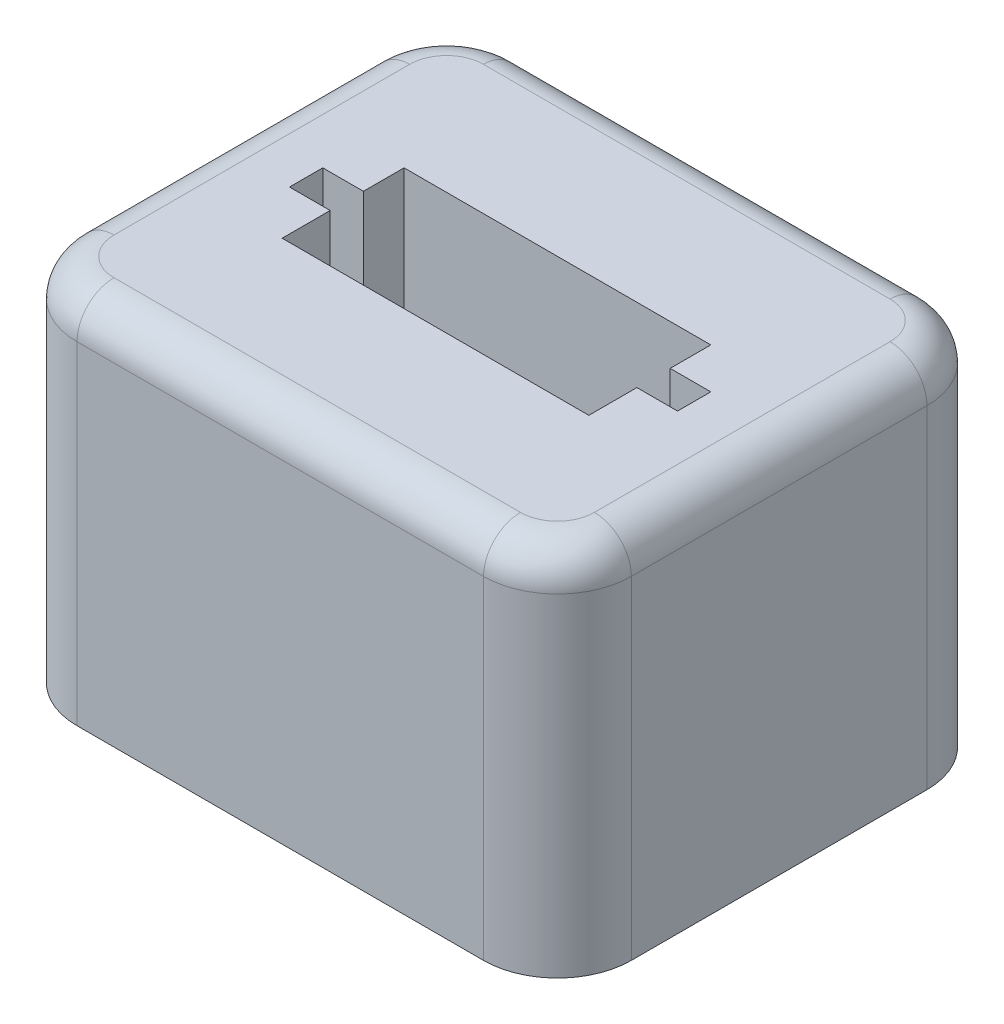
ISO-10303-21;
HEADER;
FILE_DESCRIPTION(('STEP AP214'),'2;1');
FILE_NAME('part.step','',(''),(''),'','','');
FILE_SCHEMA(('AUTOMOTIVE_DESIGN { 1 0 10303 214 1 1 1 1 }'));
ENDSEC;
DATA;
#1=APPLICATION_CONTEXT('core data for automotive mechanical design processes');
#2=APPLICATION_PROTOCOL_DEFINITION('international standard','automotive_design',2000,#1);
#3=PRODUCT_CONTEXT('',#1,'mechanical');
#4=PRODUCT('Part','Part','',(#3));
#5=PRODUCT_RELATED_PRODUCT_CATEGORY('part','',(#4));
#6=PRODUCT_DEFINITION_FORMATION('','',#4);
#7=PRODUCT_DEFINITION_CONTEXT('part definition',#1,'design');
#8=PRODUCT_DEFINITION('design','',#6,#7);
#9=PRODUCT_DEFINITION_SHAPE('','',#8);
#10=(LENGTH_UNIT() NAMED_UNIT(*) SI_UNIT(.MILLI.,.METRE.));
#11=(NAMED_UNIT(*) PLANE_ANGLE_UNIT() SI_UNIT($,.RADIAN.));
#12=(NAMED_UNIT(*) SI_UNIT($,.STERADIAN.) SOLID_ANGLE_UNIT());
#13=UNCERTAINTY_MEASURE_WITH_UNIT(LENGTH_MEASURE(1.E-05),#10,'distance_accuracy_value','');
#14=(GEOMETRIC_REPRESENTATION_CONTEXT(3) GLOBAL_UNCERTAINTY_ASSIGNED_CONTEXT((#13)) GLOBAL_UNIT_ASSIGNED_CONTEXT((#10,
#11,#12)) REPRESENTATION_CONTEXT('',''));
#15=CARTESIAN_POINT('',(0.,0.,0.));
#16=DIRECTION('',(0.,0.,1.));
#17=DIRECTION('',(1.,0.,0.));
#18=AXIS2_PLACEMENT_3D('',#15,#16,#17);
#19=CARTESIAN_POINT('',(4.5,-21.0770016843004,-12.8));
#20=DIRECTION('',(0.,0.,-1.));
#21=DIRECTION('',(-1.,0.,0.));
#22=AXIS2_PLACEMENT_3D('',#19,#20,#21);
#23=PLANE('',#22);
#24=DIRECTION('',(-1.,0.,0.));
#25=VECTOR('',#24,1.);
#26=CARTESIAN_POINT('',(4.5,20.,-12.8));
#27=LINE('',#26,#25);
#28=CARTESIAN_POINT('',(25.5,20.,-12.8));
#29=VERTEX_POINT('',#28);
#30=CARTESIAN_POINT('',(23.3,20.,-12.8));
#31=VERTEX_POINT('',#30);
#32=EDGE_CURVE('E235',#29,#31,#27,.T.);
#33=ORIENTED_EDGE('',*,*,#32,.T.);
#34=DIRECTION('',(0.,1.,0.));
#35=VECTOR('',#34,1.);
#36=CARTESIAN_POINT('',(23.3,-8.74514855114759,-12.8));
#37=LINE('',#36,#35);
#38=CARTESIAN_POINT('',(23.3,7.99999999999999,-12.8));
#39=VERTEX_POINT('',#38);
#40=EDGE_CURVE('E222',#39,#31,#37,.T.);
#41=ORIENTED_EDGE('',*,*,#40,.F.);
#42=DIRECTION('',(-1.,0.,0.));
#43=VECTOR('',#42,1.);
#44=CARTESIAN_POINT('',(4.5,8.,-12.8));
#45=LINE('',#44,#43);
#46=CARTESIAN_POINT('',(25.5,8.,-12.8));
#47=VERTEX_POINT('',#46);
#48=EDGE_CURVE('E232',#47,#39,#45,.T.);
#49=ORIENTED_EDGE('',*,*,#48,.F.);
#50=DIRECTION('',(0.,1.,0.));
#51=VECTOR('',#50,1.);
#52=CARTESIAN_POINT('',(25.5,-21.0770016843004,-12.8));
#53=LINE('',#52,#51);
#54=EDGE_CURVE('E252',#47,#29,#53,.T.);
#55=ORIENTED_EDGE('',*,*,#54,.T.);
#56=EDGE_LOOP('',(#33,#41,#49,#55));
#57=FACE_BOUND('',#56,.T.);
#58=ADVANCED_FACE('F43',(#57),#23,.F.);
#59=CARTESIAN_POINT('',(26.,20.,-20.));
#60=DIRECTION('',(0.,-1.,0.));
#61=DIRECTION('',(0.,0.,-1.));
#62=AXIS2_PLACEMENT_3D('',#59,#60,#61);
#63=CYLINDRICAL_SURFACE('',#62,4.);
#64=DIRECTION('',(0.,-1.,0.));
#65=VECTOR('',#64,1.);
#66=CARTESIAN_POINT('',(26.,20.,-24.));
#67=LINE('',#66,#65);
#68=CARTESIAN_POINT('',(26.,18.,-24.));
#69=VERTEX_POINT('',#68);
#70=CARTESIAN_POINT('',(26.,0.,-24.));
#71=VERTEX_POINT('',#70);
#72=EDGE_CURVE('E409',#69,#71,#67,.T.);
#73=ORIENTED_EDGE('',*,*,#72,.F.);
#74=CARTESIAN_POINT('',(26.,18.,-20.));
#75=DIRECTION('',(0.,-1.,0.));
#76=DIRECTION('',(0.,0.,-1.));
#77=AXIS2_PLACEMENT_3D('',#74,#75,#76);
#78=CIRCLE('',#77,4.);
#79=CARTESIAN_POINT('',(30.,18.,-20.));
#80=VERTEX_POINT('',#79);
#81=EDGE_CURVE('E456',#69,#80,#78,.T.);
#82=ORIENTED_EDGE('',*,*,#81,.T.);
#83=DIRECTION('',(0.,-1.,0.));
#84=VECTOR('',#83,1.);
#85=CARTESIAN_POINT('',(30.,20.,-20.));
#86=LINE('',#85,#84);
#87=CARTESIAN_POINT('',(30.,0.,-20.));
#88=VERTEX_POINT('',#87);
#89=EDGE_CURVE('E388',#80,#88,#86,.T.);
#90=ORIENTED_EDGE('',*,*,#89,.T.);
#91=CARTESIAN_POINT('',(26.,0.,-20.));
#92=DIRECTION('',(0.,1.,0.));
#93=DIRECTION('',(0.,0.,-1.));
#94=AXIS2_PLACEMENT_3D('',#91,#92,#93);
#95=CIRCLE('',#94,4.);
#96=EDGE_CURVE('E355',#88,#71,#95,.T.);
#97=ORIENTED_EDGE('',*,*,#96,.T.);
#98=EDGE_LOOP('',(#73,#82,#90,#97));
#99=FACE_BOUND('',#98,.T.);
#100=ADVANCED_FACE('F568',(#99),#63,.T.);
#101=CARTESIAN_POINT('',(4.00000000000003,20.,-24.));
#102=DIRECTION('',(0.,0.,1.));
#103=DIRECTION('',(1.,0.,0.));
#104=AXIS2_PLACEMENT_3D('',#101,#102,#103);
#105=PLANE('',#104);
#106=DIRECTION('',(0.,-1.,0.));
#107=VECTOR('',#106,1.);
#108=CARTESIAN_POINT('',(4.00000000000003,20.,-24.));
#109=LINE('',#108,#107);
#110=CARTESIAN_POINT('',(4.00000000000003,18.,-24.));
#111=VERTEX_POINT('',#110);
#112=CARTESIAN_POINT('',(4.00000000000003,0.,-24.));
#113=VERTEX_POINT('',#112);
#114=EDGE_CURVE('E406',#111,#113,#109,.T.);
#115=ORIENTED_EDGE('',*,*,#114,.F.);
#116=DIRECTION('',(-1.,0.,0.));
#117=VECTOR('',#116,1.);
#118=CARTESIAN_POINT('',(4.00000000000003,18.,-24.));
#119=LINE('',#118,#117);
#120=EDGE_CURVE('E453',#111,#69,#119,.F.);
#121=ORIENTED_EDGE('',*,*,#120,.T.);
#122=ORIENTED_EDGE('',*,*,#72,.T.);
#123=DIRECTION('',(-1.,0.,0.));
#124=VECTOR('',#123,1.);
#125=CARTESIAN_POINT('',(4.00000000000003,0.,-24.));
#126=LINE('',#125,#124);
#127=EDGE_CURVE('E359',#71,#113,#126,.T.);
#128=ORIENTED_EDGE('',*,*,#127,.T.);
#129=EDGE_LOOP('',(#115,#121,#122,#128));
#130=FACE_BOUND('',#129,.T.);
#131=ADVANCED_FACE('F573',(#130),#105,.F.);
#132=CARTESIAN_POINT('',(4.,20.,-20.));
#133=DIRECTION('',(0.,-1.,0.));
#134=DIRECTION('',(0.,0.,-1.));
#135=AXIS2_PLACEMENT_3D('',#132,#133,#134);
#136=CYLINDRICAL_SURFACE('',#135,4.);
#137=DIRECTION('',(0.,-1.,0.));
#138=VECTOR('',#137,1.);
#139=CARTESIAN_POINT('',(0.,20.,-20.));
#140=LINE('',#139,#138);
#141=CARTESIAN_POINT('',(0.,18.,-20.));
#142=VERTEX_POINT('',#141);
#143=CARTESIAN_POINT('',(0.,0.,-20.));
#144=VERTEX_POINT('',#143);
#145=EDGE_CURVE('E403',#142,#144,#140,.T.);
#146=ORIENTED_EDGE('',*,*,#145,.F.);
#147=CARTESIAN_POINT('',(4.,18.,-20.));
#148=DIRECTION('',(0.,-1.,0.));
#149=DIRECTION('',(0.,0.,-1.));
#150=AXIS2_PLACEMENT_3D('',#147,#148,#149);
#151=CIRCLE('',#150,4.);
#152=EDGE_CURVE('E450',#142,#111,#151,.T.);
#153=ORIENTED_EDGE('',*,*,#152,.T.);
#154=ORIENTED_EDGE('',*,*,#114,.T.);
#155=CARTESIAN_POINT('',(4.,0.,-20.));
#156=DIRECTION('',(0.,1.,0.));
#157=DIRECTION('',(0.,0.,-1.));
#158=AXIS2_PLACEMENT_3D('',#155,#156,#157);
#159=CIRCLE('',#158,4.);
#160=EDGE_CURVE('E364',#113,#144,#159,.T.);
#161=ORIENTED_EDGE('',*,*,#160,.T.);
#162=EDGE_LOOP('',(#146,#153,#154,#161));
#163=FACE_BOUND('',#162,.T.);
#164=ADVANCED_FACE('F667',(#163),#136,.T.);
#165=CARTESIAN_POINT('',(0.,20.,-4.00000000000003));
#166=DIRECTION('',(1.,0.,0.));
#167=DIRECTION('',(0.,0.,-1.));
#168=AXIS2_PLACEMENT_3D('',#165,#166,#167);
#169=PLANE('',#168);
#170=DIRECTION('',(0.,-1.,0.));
#171=VECTOR('',#170,1.);
#172=CARTESIAN_POINT('',(0.,20.,-4.00000000000003));
#173=LINE('',#172,#171);
#174=CARTESIAN_POINT('',(0.,18.,-4.00000000000003));
#175=VERTEX_POINT('',#174);
#176=CARTESIAN_POINT('',(0.,0.,-4.00000000000003));
#177=VERTEX_POINT('',#176);
#178=EDGE_CURVE('E400',#175,#177,#173,.T.);
#179=ORIENTED_EDGE('',*,*,#178,.F.);
#180=DIRECTION('',(0.,0.,1.));
#181=VECTOR('',#180,1.);
#182=CARTESIAN_POINT('',(0.,18.,-4.00000000000003));
#183=LINE('',#182,#181);
#184=EDGE_CURVE('E447',#175,#142,#183,.F.);
#185=ORIENTED_EDGE('',*,*,#184,.T.);
#186=ORIENTED_EDGE('',*,*,#145,.T.);
#187=DIRECTION('',(0.,0.,1.));
#188=VECTOR('',#187,1.);
#189=CARTESIAN_POINT('',(0.,0.,-4.00000000000003));
#190=LINE('',#189,#188);
#191=EDGE_CURVE('E368',#144,#177,#190,.T.);
#192=ORIENTED_EDGE('',*,*,#191,.T.);
#193=EDGE_LOOP('',(#179,#185,#186,#192));
#194=FACE_BOUND('',#193,.T.);
#195=ADVANCED_FACE('F663',(#194),#169,.F.);
#196=CARTESIAN_POINT('',(4.,20.,-4.));
#197=DIRECTION('',(0.,-1.,0.));
#198=DIRECTION('',(0.,0.,-1.));
#199=AXIS2_PLACEMENT_3D('',#196,#197,#198);
#200=CYLINDRICAL_SURFACE('',#199,4.);
#201=DIRECTION('',(0.,-1.,0.));
#202=VECTOR('',#201,1.);
#203=CARTESIAN_POINT('',(4.00000000000003,20.,0.));
#204=LINE('',#203,#202);
#205=CARTESIAN_POINT('',(4.00000000000003,18.,0.));
#206=VERTEX_POINT('',#205);
#207=CARTESIAN_POINT('',(4.00000000000003,0.,0.));
#208=VERTEX_POINT('',#207);
#209=EDGE_CURVE('E397',#206,#208,#204,.T.);
#210=ORIENTED_EDGE('',*,*,#209,.F.);
#211=CARTESIAN_POINT('',(4.,18.,-4.));
#212=DIRECTION('',(0.,-1.,0.));
#213=DIRECTION('',(0.,0.,-1.));
#214=AXIS2_PLACEMENT_3D('',#211,#212,#213);
#215=CIRCLE('',#214,4.);
#216=EDGE_CURVE('E444',#206,#175,#215,.T.);
#217=ORIENTED_EDGE('',*,*,#216,.T.);
#218=ORIENTED_EDGE('',*,*,#178,.T.);
#219=CARTESIAN_POINT('',(4.,0.,-4.));
#220=DIRECTION('',(0.,1.,0.));
#221=DIRECTION('',(0.,0.,-1.));
#222=AXIS2_PLACEMENT_3D('',#219,#220,#221);
#223=CIRCLE('',#222,4.);
#224=EDGE_CURVE('E372',#177,#208,#223,.T.);
#225=ORIENTED_EDGE('',*,*,#224,.T.);
#226=EDGE_LOOP('',(#210,#217,#218,#225));
#227=FACE_BOUND('',#226,.T.);
#228=ADVANCED_FACE('F659',(#227),#200,.T.);
#229=CARTESIAN_POINT('',(4.00000000000003,20.,0.));
#230=DIRECTION('',(0.,0.,-1.));
#231=DIRECTION('',(-1.,0.,0.));
#232=AXIS2_PLACEMENT_3D('',#229,#230,#231);
#233=PLANE('',#232);
#234=DIRECTION('',(0.,-1.,0.));
#235=VECTOR('',#234,1.);
#236=CARTESIAN_POINT('',(26.,20.,0.));
#237=LINE('',#236,#235);
#238=CARTESIAN_POINT('',(26.,18.,0.));
#239=VERTEX_POINT('',#238);
#240=CARTESIAN_POINT('',(26.,0.,0.));
#241=VERTEX_POINT('',#240);
#242=EDGE_CURVE('E394',#239,#241,#237,.T.);
#243=ORIENTED_EDGE('',*,*,#242,.F.);
#244=DIRECTION('',(1.,0.,0.));
#245=VECTOR('',#244,1.);
#246=CARTESIAN_POINT('',(4.00000000000003,18.,0.));
#247=LINE('',#246,#245);
#248=EDGE_CURVE('E441',#239,#206,#247,.F.);
#249=ORIENTED_EDGE('',*,*,#248,.T.);
#250=ORIENTED_EDGE('',*,*,#209,.T.);
#251=DIRECTION('',(1.,0.,0.));
#252=VECTOR('',#251,1.);
#253=CARTESIAN_POINT('',(4.00000000000003,0.,0.));
#254=LINE('',#253,#252);
#255=EDGE_CURVE('E376',#208,#241,#254,.T.);
#256=ORIENTED_EDGE('',*,*,#255,.T.);
#257=EDGE_LOOP('',(#243,#249,#250,#256));
#258=FACE_BOUND('',#257,.T.);
#259=ADVANCED_FACE('F655',(#258),#233,.F.);
#260=CARTESIAN_POINT('',(26.,20.,-4.));
#261=DIRECTION('',(0.,-1.,0.));
#262=DIRECTION('',(0.,0.,-1.));
#263=AXIS2_PLACEMENT_3D('',#260,#261,#262);
#264=CYLINDRICAL_SURFACE('',#263,4.);
#265=DIRECTION('',(0.,-1.,0.));
#266=VECTOR('',#265,1.);
#267=CARTESIAN_POINT('',(30.,20.,-4.00000000000003));
#268=LINE('',#267,#266);
#269=CARTESIAN_POINT('',(30.,18.,-4.00000000000003));
#270=VERTEX_POINT('',#269);
#271=CARTESIAN_POINT('',(30.,0.,-4.00000000000003));
#272=VERTEX_POINT('',#271);
#273=EDGE_CURVE('E391',#270,#272,#268,.T.);
#274=ORIENTED_EDGE('',*,*,#273,.F.);
#275=CARTESIAN_POINT('',(26.,18.,-4.));
#276=DIRECTION('',(0.,-1.,0.));
#277=DIRECTION('',(0.,0.,-1.));
#278=AXIS2_PLACEMENT_3D('',#275,#276,#277);
#279=CIRCLE('',#278,4.);
#280=EDGE_CURVE('E437',#270,#239,#279,.T.);
#281=ORIENTED_EDGE('',*,*,#280,.T.);
#282=ORIENTED_EDGE('',*,*,#242,.T.);
#283=CARTESIAN_POINT('',(26.,0.,-4.));
#284=DIRECTION('',(0.,1.,0.));
#285=DIRECTION('',(0.,0.,1.));
#286=AXIS2_PLACEMENT_3D('',#283,#284,#285);
#287=CIRCLE('',#286,4.);
#288=EDGE_CURVE('E380',#241,#272,#287,.T.);
#289=ORIENTED_EDGE('',*,*,#288,.T.);
#290=EDGE_LOOP('',(#274,#281,#282,#289));
#291=FACE_BOUND('',#290,.T.);
#292=ADVANCED_FACE('F651',(#291),#264,.T.);
#293=CARTESIAN_POINT('',(30.,20.,-4.00000000000003));
#294=DIRECTION('',(-1.,0.,0.));
#295=DIRECTION('',(0.,0.,1.));
#296=AXIS2_PLACEMENT_3D('',#293,#294,#295);
#297=PLANE('',#296);
#298=ORIENTED_EDGE('',*,*,#89,.F.);
#299=DIRECTION('',(0.,0.,-1.));
#300=VECTOR('',#299,1.);
#301=CARTESIAN_POINT('',(30.,18.,-4.00000000000003));
#302=LINE('',#301,#300);
#303=EDGE_CURVE('E459',#80,#270,#302,.F.);
#304=ORIENTED_EDGE('',*,*,#303,.T.);
#305=ORIENTED_EDGE('',*,*,#273,.T.);
#306=DIRECTION('',(0.,0.,-1.));
#307=VECTOR('',#306,1.);
#308=CARTESIAN_POINT('',(30.,0.,-4.00000000000003));
#309=LINE('',#308,#307);
#310=EDGE_CURVE('E384',#272,#88,#309,.T.);
#311=ORIENTED_EDGE('',*,*,#310,.T.);
#312=EDGE_LOOP('',(#298,#304,#305,#311));
#313=FACE_BOUND('',#312,.T.);
#314=ADVANCED_FACE('F645',(#313),#297,.F.);
#315=CARTESIAN_POINT('',(26.,20.,-20.));
#316=DIRECTION('',(0.,-1.,0.));
#317=DIRECTION('',(0.,0.,-1.));
#318=AXIS2_PLACEMENT_3D('',#315,#316,#317);
#319=PLANE('',#318);
#320=DIRECTION('',(-1.,0.,0.));
#321=VECTOR('',#320,1.);
#322=CARTESIAN_POINT('',(6.7,20.,-15.));
#323=LINE('',#322,#321);
#324=CARTESIAN_POINT('',(23.3,20.,-15.));
#325=VERTEX_POINT('',#324);
#326=CARTESIAN_POINT('',(6.7,20.,-15.));
#327=VERTEX_POINT('',#326);
#328=EDGE_CURVE('E237',#325,#327,#323,.T.);
#329=ORIENTED_EDGE('',*,*,#328,.F.);
#330=DIRECTION('',(0.,0.,-1.));
#331=VECTOR('',#330,1.);
#332=CARTESIAN_POINT('',(23.3,20.,-12.8));
#333=LINE('',#332,#331);
#334=EDGE_CURVE('E540',#31,#325,#333,.T.);
#335=ORIENTED_EDGE('',*,*,#334,.F.);
#336=ORIENTED_EDGE('',*,*,#32,.F.);
#337=DIRECTION('',(0.,0.,-1.));
#338=VECTOR('',#337,1.);
#339=CARTESIAN_POINT('',(25.5,20.,-12.8));
#340=LINE('',#339,#338);
#341=CARTESIAN_POINT('',(25.5,20.,-11.));
#342=VERTEX_POINT('',#341);
#343=EDGE_CURVE('E505',#342,#29,#340,.T.);
#344=ORIENTED_EDGE('',*,*,#343,.F.);
#345=DIRECTION('',(1.,0.,0.));
#346=VECTOR('',#345,1.);
#347=CARTESIAN_POINT('',(4.5,20.,-11.));
#348=LINE('',#347,#346);
#349=CARTESIAN_POINT('',(23.3,20.,-11.));
#350=VERTEX_POINT('',#349);
#351=EDGE_CURVE('E497',#350,#342,#348,.T.);
#352=ORIENTED_EDGE('',*,*,#351,.F.);
#353=DIRECTION('',(0.,0.,-1.));
#354=VECTOR('',#353,1.);
#355=CARTESIAN_POINT('',(23.3,20.,-11.4));
#356=LINE('',#355,#354);
#357=CARTESIAN_POINT('',(23.3,20.,-8.4));
#358=VERTEX_POINT('',#357);
#359=EDGE_CURVE('E299',#358,#350,#356,.T.);
#360=ORIENTED_EDGE('',*,*,#359,.F.);
#361=DIRECTION('',(1.,0.,0.));
#362=VECTOR('',#361,1.);
#363=CARTESIAN_POINT('',(6.7,20.,-8.4));
#364=LINE('',#363,#362);
#365=CARTESIAN_POINT('',(6.7,20.,-8.4));
#366=VERTEX_POINT('',#365);
#367=EDGE_CURVE('E295',#366,#358,#364,.T.);
#368=ORIENTED_EDGE('',*,*,#367,.F.);
#369=DIRECTION('',(0.,0.,1.));
#370=VECTOR('',#369,1.);
#371=CARTESIAN_POINT('',(6.7,20.,-11.4));
#372=LINE('',#371,#370);
#373=CARTESIAN_POINT('',(6.7,20.,-11.));
#374=VERTEX_POINT('',#373);
#375=EDGE_CURVE('E292',#374,#366,#372,.T.);
#376=ORIENTED_EDGE('',*,*,#375,.F.);
#377=CARTESIAN_POINT('',(4.5,20.,-11.));
#378=VERTEX_POINT('',#377);
#379=EDGE_CURVE('E507',#378,#374,#348,.T.);
#380=ORIENTED_EDGE('',*,*,#379,.F.);
#381=DIRECTION('',(0.,0.,1.));
#382=VECTOR('',#381,1.);
#383=CARTESIAN_POINT('',(4.5,20.,-12.8));
#384=LINE('',#383,#382);
#385=CARTESIAN_POINT('',(4.5,20.,-12.8));
#386=VERTEX_POINT('',#385);
#387=EDGE_CURVE('E508',#386,#378,#384,.T.);
#388=ORIENTED_EDGE('',*,*,#387,.F.);
#389=CARTESIAN_POINT('',(6.7,20.,-12.8));
#390=VERTEX_POINT('',#389);
#391=EDGE_CURVE('E522',#390,#386,#27,.T.);
#392=ORIENTED_EDGE('',*,*,#391,.F.);
#393=DIRECTION('',(0.,0.,1.));
#394=VECTOR('',#393,1.);
#395=CARTESIAN_POINT('',(6.7,20.,-12.8));
#396=LINE('',#395,#394);
#397=EDGE_CURVE('E59',#327,#390,#396,.T.);
#398=ORIENTED_EDGE('',*,*,#397,.F.);
#399=EDGE_LOOP('',(#329,#335,#336,#344,#352,#360,#368,#376,#380,#388,#392,#398));
#400=FACE_BOUND('',#399,.T.);
#401=DIRECTION('',(1.,0.,0.));
#402=VECTOR('',#401,1.);
#403=CARTESIAN_POINT('',(26.,20.,-2.));
#404=LINE('',#403,#402);
#405=CARTESIAN_POINT('',(4.00000000000003,20.,-2.));
#406=VERTEX_POINT('',#405);
#407=CARTESIAN_POINT('',(26.,20.,-2.));
#408=VERTEX_POINT('',#407);
#409=EDGE_CURVE('E430',#406,#408,#404,.T.);
#410=ORIENTED_EDGE('',*,*,#409,.T.);
#411=CARTESIAN_POINT('',(26.,20.,-4.));
#412=DIRECTION('',(0.,-1.,0.));
#413=DIRECTION('',(0.,0.,-1.));
#414=AXIS2_PLACEMENT_3D('',#411,#412,#413);
#415=CIRCLE('',#414,2.);
#416=CARTESIAN_POINT('',(28.,20.,-4.00000000000001));
#417=VERTEX_POINT('',#416);
#418=EDGE_CURVE('E433',#408,#417,#415,.F.);
#419=ORIENTED_EDGE('',*,*,#418,.T.);
#420=DIRECTION('',(0.,0.,-1.));
#421=VECTOR('',#420,1.);
#422=CARTESIAN_POINT('',(28.,20.,-20.));
#423=LINE('',#422,#421);
#424=CARTESIAN_POINT('',(28.,20.,-20.));
#425=VERTEX_POINT('',#424);
#426=EDGE_CURVE('E412',#417,#425,#423,.T.);
#427=ORIENTED_EDGE('',*,*,#426,.T.);
#428=CARTESIAN_POINT('',(26.,20.,-20.));
#429=DIRECTION('',(0.,-1.,0.));
#430=DIRECTION('',(0.,0.,-1.));
#431=AXIS2_PLACEMENT_3D('',#428,#429,#430);
#432=CIRCLE('',#431,2.);
#433=CARTESIAN_POINT('',(26.,20.,-22.));
#434=VERTEX_POINT('',#433);
#435=EDGE_CURVE('E415',#425,#434,#432,.F.);
#436=ORIENTED_EDGE('',*,*,#435,.T.);
#437=DIRECTION('',(-1.,0.,0.));
#438=VECTOR('',#437,1.);
#439=CARTESIAN_POINT('',(26.,20.,-22.));
#440=LINE('',#439,#438);
#441=CARTESIAN_POINT('',(4.00000000000001,20.,-22.));
#442=VERTEX_POINT('',#441);
#443=EDGE_CURVE('E418',#434,#442,#440,.T.);
#444=ORIENTED_EDGE('',*,*,#443,.T.);
#445=CARTESIAN_POINT('',(4.,20.,-20.));
#446=DIRECTION('',(0.,-1.,0.));
#447=DIRECTION('',(0.,0.,-1.));
#448=AXIS2_PLACEMENT_3D('',#445,#446,#447);
#449=CIRCLE('',#448,2.);
#450=CARTESIAN_POINT('',(2.,20.,-20.));
#451=VERTEX_POINT('',#450);
#452=EDGE_CURVE('E421',#442,#451,#449,.F.);
#453=ORIENTED_EDGE('',*,*,#452,.T.);
#454=DIRECTION('',(0.,0.,1.));
#455=VECTOR('',#454,1.);
#456=CARTESIAN_POINT('',(2.,20.,-20.));
#457=LINE('',#456,#455);
#458=CARTESIAN_POINT('',(2.,20.,-4.00000000000001));
#459=VERTEX_POINT('',#458);
#460=EDGE_CURVE('E424',#451,#459,#457,.T.);
#461=ORIENTED_EDGE('',*,*,#460,.T.);
#462=CARTESIAN_POINT('',(4.,20.,-4.));
#463=DIRECTION('',(0.,-1.,0.));
#464=DIRECTION('',(0.,0.,-1.));
#465=AXIS2_PLACEMENT_3D('',#462,#463,#464);
#466=CIRCLE('',#465,2.);
#467=EDGE_CURVE('E427',#459,#406,#466,.F.);
#468=ORIENTED_EDGE('',*,*,#467,.T.);
#469=EDGE_LOOP('',(#410,#419,#427,#436,#444,#453,#461,#468));
#470=FACE_BOUND('',#469,.T.);
#471=ADVANCED_FACE('F501',(#400,#470),#319,.F.);
#472=CARTESIAN_POINT('',(26.,0.,-20.));
#473=DIRECTION('',(0.,-1.,0.));
#474=DIRECTION('',(0.,0.,-1.));
#475=AXIS2_PLACEMENT_3D('',#472,#473,#474);
#476=PLANE('',#475);
#477=DIRECTION('',(0.,0.,1.));
#478=VECTOR('',#477,1.);
#479=CARTESIAN_POINT('',(6.7,0.,-11.4));
#480=LINE('',#479,#478);
#481=CARTESIAN_POINT('',(6.7,0.,-11.4));
#482=VERTEX_POINT('',#481);
#483=CARTESIAN_POINT('',(6.7,0.,-8.4));
#484=VERTEX_POINT('',#483);
#485=EDGE_CURVE('E288',#482,#484,#480,.T.);
#486=ORIENTED_EDGE('',*,*,#485,.T.);
#487=DIRECTION('',(1.,0.,0.));
#488=VECTOR('',#487,1.);
#489=CARTESIAN_POINT('',(6.7,0.,-8.4));
#490=LINE('',#489,#488);
#491=CARTESIAN_POINT('',(23.3,0.,-8.4));
#492=VERTEX_POINT('',#491);
#493=EDGE_CURVE('E308',#484,#492,#490,.T.);
#494=ORIENTED_EDGE('',*,*,#493,.T.);
#495=DIRECTION('',(0.,0.,-1.));
#496=VECTOR('',#495,1.);
#497=CARTESIAN_POINT('',(23.3,0.,-11.4));
#498=LINE('',#497,#496);
#499=CARTESIAN_POINT('',(23.3,0.,-11.4));
#500=VERTEX_POINT('',#499);
#501=EDGE_CURVE('E280',#492,#500,#498,.T.);
#502=ORIENTED_EDGE('',*,*,#501,.T.);
#503=DIRECTION('',(-1.,0.,0.));
#504=VECTOR('',#503,1.);
#505=CARTESIAN_POINT('',(6.7,0.,-11.4));
#506=LINE('',#505,#504);
#507=EDGE_CURVE('E284',#500,#482,#506,.T.);
#508=ORIENTED_EDGE('',*,*,#507,.T.);
#509=EDGE_LOOP('',(#486,#494,#502,#508));
#510=FACE_BOUND('',#509,.T.);
#511=CARTESIAN_POINT('',(4.,0.,-20.));
#512=DIRECTION('',(0.,-1.,0.));
#513=DIRECTION('',(0.,0.,-1.));
#514=AXIS2_PLACEMENT_3D('',#511,#512,#513);
#515=CIRCLE('',#514,1.);
#516=CARTESIAN_POINT('',(4.,0.,-21.));
#517=VERTEX_POINT('',#516);
#518=EDGE_CURVE('E322',#517,#517,#515,.T.);
#519=ORIENTED_EDGE('',*,*,#518,.F.);
#520=EDGE_LOOP('',(#519));
#521=FACE_BOUND('',#520,.T.);
#522=CARTESIAN_POINT('',(26.,0.,-20.));
#523=DIRECTION('',(0.,-1.,0.));
#524=DIRECTION('',(0.,0.,-1.));
#525=AXIS2_PLACEMENT_3D('',#522,#523,#524);
#526=CIRCLE('',#525,1.);
#527=CARTESIAN_POINT('',(26.,0.,-21.));
#528=VERTEX_POINT('',#527);
#529=EDGE_CURVE('E336',#528,#528,#526,.T.);
#530=ORIENTED_EDGE('',*,*,#529,.F.);
#531=EDGE_LOOP('',(#530));
#532=FACE_BOUND('',#531,.T.);
#533=CARTESIAN_POINT('',(26.,0.,-4.));
#534=DIRECTION('',(0.,-1.,0.));
#535=DIRECTION('',(0.,0.,-1.));
#536=AXIS2_PLACEMENT_3D('',#533,#534,#535);
#537=CIRCLE('',#536,1.);
#538=CARTESIAN_POINT('',(26.,0.,-5.));
#539=VERTEX_POINT('',#538);
#540=EDGE_CURVE('E328',#539,#539,#537,.T.);
#541=ORIENTED_EDGE('',*,*,#540,.F.);
#542=EDGE_LOOP('',(#541));
#543=FACE_BOUND('',#542,.T.);
#544=CARTESIAN_POINT('',(4.,0.,-4.));
#545=DIRECTION('',(0.,-1.,0.));
#546=DIRECTION('',(0.,0.,-1.));
#547=AXIS2_PLACEMENT_3D('',#544,#545,#546);
#548=CIRCLE('',#547,1.);
#549=CARTESIAN_POINT('',(4.,0.,-5.));
#550=VERTEX_POINT('',#549);
#551=EDGE_CURVE('E327',#550,#550,#548,.T.);
#552=ORIENTED_EDGE('',*,*,#551,.F.);
#553=EDGE_LOOP('',(#552));
#554=FACE_BOUND('',#553,.T.);
#555=ORIENTED_EDGE('',*,*,#96,.F.);
#556=ORIENTED_EDGE('',*,*,#310,.F.);
#557=ORIENTED_EDGE('',*,*,#288,.F.);
#558=ORIENTED_EDGE('',*,*,#255,.F.);
#559=ORIENTED_EDGE('',*,*,#224,.F.);
#560=ORIENTED_EDGE('',*,*,#191,.F.);
#561=ORIENTED_EDGE('',*,*,#160,.F.);
#562=ORIENTED_EDGE('',*,*,#127,.F.);
#563=EDGE_LOOP('',(#555,#556,#557,#558,#559,#560,#561,#562));
#564=FACE_BOUND('',#563,.T.);
#565=ADVANCED_FACE('F644',(#510,#521,#532,#543,#554,#564),#476,.T.);
#566=CARTESIAN_POINT('',(4.,18.,-20.));
#567=DIRECTION('',(0.,-1.,0.));
#568=DIRECTION('',(0.,0.,-1.));
#569=AXIS2_PLACEMENT_3D('',#566,#567,#568);
#570=DEGENERATE_TOROIDAL_SURFACE('',#569,2.,2.,.T.);
#571=CARTESIAN_POINT('',(4.00000000000001,18.,-22.));
#572=DIRECTION('',(1.,0.,0.));
#573=DIRECTION('',(0.,0.,-1.));
#574=AXIS2_PLACEMENT_3D('',#571,#572,#573);
#575=CIRCLE('',#574,2.);
#576=EDGE_CURVE('E483',#111,#442,#575,.T.);
#577=ORIENTED_EDGE('',*,*,#576,.F.);
#578=ORIENTED_EDGE('',*,*,#152,.F.);
#579=CARTESIAN_POINT('',(2.,18.,-20.));
#580=DIRECTION('',(0.,0.,1.));
#581=DIRECTION('',(1.,0.,0.));
#582=AXIS2_PLACEMENT_3D('',#579,#580,#581);
#583=CIRCLE('',#582,2.);
#584=EDGE_CURVE('E360',#451,#142,#583,.T.);
#585=ORIENTED_EDGE('',*,*,#584,.F.);
#586=ORIENTED_EDGE('',*,*,#452,.F.);
#587=EDGE_LOOP('',(#577,#578,#585,#586));
#588=FACE_BOUND('',#587,.T.);
#589=ADVANCED_FACE('F45',(#588),#570,.T.);
#590=CARTESIAN_POINT('',(2.,18.,-20.));
#591=DIRECTION('',(0.,0.,1.));
#592=DIRECTION('',(1.,0.,0.));
#593=AXIS2_PLACEMENT_3D('',#590,#591,#592);
#594=CYLINDRICAL_SURFACE('',#593,2.);
#595=ORIENTED_EDGE('',*,*,#584,.T.);
#596=ORIENTED_EDGE('',*,*,#184,.F.);
#597=CARTESIAN_POINT('',(2.,18.,-4.00000000000001));
#598=DIRECTION('',(0.,0.,1.));
#599=DIRECTION('',(1.,0.,0.));
#600=AXIS2_PLACEMENT_3D('',#597,#598,#599);
#601=CIRCLE('',#600,2.);
#602=EDGE_CURVE('E479',#459,#175,#601,.T.);
#603=ORIENTED_EDGE('',*,*,#602,.F.);
#604=ORIENTED_EDGE('',*,*,#460,.F.);
#605=EDGE_LOOP('',(#595,#596,#603,#604));
#606=FACE_BOUND('',#605,.T.);
#607=ADVANCED_FACE('F696',(#606),#594,.T.);
#608=CARTESIAN_POINT('',(26.,18.,-22.));
#609=DIRECTION('',(-1.,0.,0.));
#610=DIRECTION('',(0.,0.,1.));
#611=AXIS2_PLACEMENT_3D('',#608,#609,#610);
#612=CYLINDRICAL_SURFACE('',#611,2.);
#613=ORIENTED_EDGE('',*,*,#576,.T.);
#614=ORIENTED_EDGE('',*,*,#443,.F.);
#615=CARTESIAN_POINT('',(26.,18.,-22.));
#616=DIRECTION('',(1.,0.,0.));
#617=DIRECTION('',(0.,0.,-1.));
#618=AXIS2_PLACEMENT_3D('',#615,#616,#617);
#619=CIRCLE('',#618,2.);
#620=EDGE_CURVE('E475',#69,#434,#619,.T.);
#621=ORIENTED_EDGE('',*,*,#620,.F.);
#622=ORIENTED_EDGE('',*,*,#120,.F.);
#623=EDGE_LOOP('',(#613,#614,#621,#622));
#624=FACE_BOUND('',#623,.T.);
#625=ADVANCED_FACE('F693',(#624),#612,.T.);
#626=CARTESIAN_POINT('',(4.,18.,-4.));
#627=DIRECTION('',(0.,-1.,0.));
#628=DIRECTION('',(0.,0.,-1.));
#629=AXIS2_PLACEMENT_3D('',#626,#627,#628);
#630=DEGENERATE_TOROIDAL_SURFACE('',#629,2.,2.,.T.);
#631=ORIENTED_EDGE('',*,*,#602,.T.);
#632=ORIENTED_EDGE('',*,*,#216,.F.);
#633=CARTESIAN_POINT('',(4.00000000000003,18.,-2.));
#634=DIRECTION('',(1.,0.,0.));
#635=DIRECTION('',(0.,0.,-1.));
#636=AXIS2_PLACEMENT_3D('',#633,#634,#635);
#637=CIRCLE('',#636,2.);
#638=EDGE_CURVE('E471',#406,#206,#637,.T.);
#639=ORIENTED_EDGE('',*,*,#638,.F.);
#640=ORIENTED_EDGE('',*,*,#467,.F.);
#641=EDGE_LOOP('',(#631,#632,#639,#640));
#642=FACE_BOUND('',#641,.T.);
#643=ADVANCED_FACE('F689',(#642),#630,.T.);
#644=CARTESIAN_POINT('',(26.,18.,-20.));
#645=DIRECTION('',(0.,-1.,0.));
#646=DIRECTION('',(0.,0.,-1.));
#647=AXIS2_PLACEMENT_3D('',#644,#645,#646);
#648=DEGENERATE_TOROIDAL_SURFACE('',#647,2.,2.,.T.);
#649=ORIENTED_EDGE('',*,*,#620,.T.);
#650=ORIENTED_EDGE('',*,*,#435,.F.);
#651=CARTESIAN_POINT('',(28.,18.,-20.));
#652=DIRECTION('',(0.,0.,1.));
#653=DIRECTION('',(1.,0.,0.));
#654=AXIS2_PLACEMENT_3D('',#651,#652,#653);
#655=CIRCLE('',#654,2.);
#656=EDGE_CURVE('E467',#80,#425,#655,.T.);
#657=ORIENTED_EDGE('',*,*,#656,.F.);
#658=ORIENTED_EDGE('',*,*,#81,.F.);
#659=EDGE_LOOP('',(#649,#650,#657,#658));
#660=FACE_BOUND('',#659,.T.);
#661=ADVANCED_FACE('F685',(#660),#648,.T.);
#662=CARTESIAN_POINT('',(26.,18.,-2.));
#663=DIRECTION('',(1.,0.,0.));
#664=DIRECTION('',(0.,0.,-1.));
#665=AXIS2_PLACEMENT_3D('',#662,#663,#664);
#666=CYLINDRICAL_SURFACE('',#665,2.);
#667=ORIENTED_EDGE('',*,*,#638,.T.);
#668=ORIENTED_EDGE('',*,*,#248,.F.);
#669=CARTESIAN_POINT('',(26.,18.,-2.));
#670=DIRECTION('',(1.,0.,0.));
#671=DIRECTION('',(0.,0.,-1.));
#672=AXIS2_PLACEMENT_3D('',#669,#670,#671);
#673=CIRCLE('',#672,2.);
#674=EDGE_CURVE('E464',#408,#239,#673,.T.);
#675=ORIENTED_EDGE('',*,*,#674,.F.);
#676=ORIENTED_EDGE('',*,*,#409,.F.);
#677=EDGE_LOOP('',(#667,#668,#675,#676));
#678=FACE_BOUND('',#677,.T.);
#679=ADVANCED_FACE('F681',(#678),#666,.T.);
#680=CARTESIAN_POINT('',(28.,18.,-20.));
#681=DIRECTION('',(0.,0.,-1.));
#682=DIRECTION('',(-1.,0.,0.));
#683=AXIS2_PLACEMENT_3D('',#680,#681,#682);
#684=CYLINDRICAL_SURFACE('',#683,2.);
#685=ORIENTED_EDGE('',*,*,#656,.T.);
#686=ORIENTED_EDGE('',*,*,#426,.F.);
#687=CARTESIAN_POINT('',(28.,18.,-4.00000000000003));
#688=DIRECTION('',(0.,0.,1.));
#689=DIRECTION('',(0.,-1.,0.));
#690=AXIS2_PLACEMENT_3D('',#687,#688,#689);
#691=CIRCLE('',#690,2.);
#692=EDGE_CURVE('E351',#270,#417,#691,.T.);
#693=ORIENTED_EDGE('',*,*,#692,.F.);
#694=ORIENTED_EDGE('',*,*,#303,.F.);
#695=EDGE_LOOP('',(#685,#686,#693,#694));
#696=FACE_BOUND('',#695,.T.);
#697=ADVANCED_FACE('F677',(#696),#684,.T.);
#698=CARTESIAN_POINT('',(26.,18.,-4.));
#699=DIRECTION('',(0.,-1.,0.));
#700=DIRECTION('',(0.,0.,-1.));
#701=AXIS2_PLACEMENT_3D('',#698,#699,#700);
#702=DEGENERATE_TOROIDAL_SURFACE('',#701,2.,2.,.T.);
#703=ORIENTED_EDGE('',*,*,#674,.T.);
#704=ORIENTED_EDGE('',*,*,#280,.F.);
#705=ORIENTED_EDGE('',*,*,#692,.T.);
#706=ORIENTED_EDGE('',*,*,#418,.F.);
#707=EDGE_LOOP('',(#703,#704,#705,#706));
#708=FACE_BOUND('',#707,.T.);
#709=ADVANCED_FACE('F640',(#708),#702,.T.);
#710=CARTESIAN_POINT('',(4.,7.,-4.));
#711=DIRECTION('',(0.,-1.,0.));
#712=DIRECTION('',(0.,0.,-1.));
#713=AXIS2_PLACEMENT_3D('',#710,#711,#712);
#714=CYLINDRICAL_SURFACE('',#713,1.);
#715=CARTESIAN_POINT('',(4.,7.,-4.));
#716=DIRECTION('',(0.,-1.,0.));
#717=DIRECTION('',(0.,0.,-1.));
#718=AXIS2_PLACEMENT_3D('',#715,#716,#717);
#719=CIRCLE('',#718,1.);
#720=CARTESIAN_POINT('',(4.,7.,-5.));
#721=VERTEX_POINT('',#720);
#722=EDGE_CURVE('E347',#721,#721,#719,.T.);
#723=ORIENTED_EDGE('',*,*,#722,.F.);
#724=EDGE_LOOP('',(#723));
#725=FACE_BOUND('',#724,.T.);
#726=ORIENTED_EDGE('',*,*,#551,.T.);
#727=EDGE_LOOP('',(#726));
#728=FACE_BOUND('',#727,.T.);
#729=ADVANCED_FACE('F636',(#725,#728),#714,.F.);
#730=CARTESIAN_POINT('',(4.,7.,-4.));
#731=DIRECTION('',(0.,-1.,0.));
#732=DIRECTION('',(0.,0.,-1.));
#733=AXIS2_PLACEMENT_3D('',#730,#731,#732);
#734=PLANE('',#733);
#735=ORIENTED_EDGE('',*,*,#722,.T.);
#736=EDGE_LOOP('',(#735));
#737=FACE_BOUND('',#736,.T.);
#738=ADVANCED_FACE('F618',(#737),#734,.T.);
#739=CARTESIAN_POINT('',(26.,7.,-4.));
#740=DIRECTION('',(0.,-1.,0.));
#741=DIRECTION('',(0.,0.,-1.));
#742=AXIS2_PLACEMENT_3D('',#739,#740,#741);
#743=CYLINDRICAL_SURFACE('',#742,1.);
#744=CARTESIAN_POINT('',(26.,7.,-4.));
#745=DIRECTION('',(0.,-1.,0.));
#746=DIRECTION('',(0.,0.,-1.));
#747=AXIS2_PLACEMENT_3D('',#744,#745,#746);
#748=CIRCLE('',#747,1.);
#749=CARTESIAN_POINT('',(26.,7.,-5.));
#750=VERTEX_POINT('',#749);
#751=EDGE_CURVE('E323',#750,#750,#748,.T.);
#752=ORIENTED_EDGE('',*,*,#751,.F.);
#753=EDGE_LOOP('',(#752));
#754=FACE_BOUND('',#753,.T.);
#755=ORIENTED_EDGE('',*,*,#540,.T.);
#756=EDGE_LOOP('',(#755));
#757=FACE_BOUND('',#756,.T.);
#758=ADVANCED_FACE('F614',(#754,#757),#743,.F.);
#759=CARTESIAN_POINT('',(26.,7.,-4.));
#760=DIRECTION('',(0.,-1.,0.));
#761=DIRECTION('',(0.,0.,-1.));
#762=AXIS2_PLACEMENT_3D('',#759,#760,#761);
#763=PLANE('',#762);
#764=ORIENTED_EDGE('',*,*,#751,.T.);
#765=EDGE_LOOP('',(#764));
#766=FACE_BOUND('',#765,.T.);
#767=ADVANCED_FACE('F610',(#766),#763,.T.);
#768=CARTESIAN_POINT('',(26.,7.,-20.));
#769=DIRECTION('',(0.,-1.,0.));
#770=DIRECTION('',(0.,0.,-1.));
#771=AXIS2_PLACEMENT_3D('',#768,#769,#770);
#772=CYLINDRICAL_SURFACE('',#771,1.);
#773=CARTESIAN_POINT('',(26.,7.,-20.));
#774=DIRECTION('',(0.,-1.,0.));
#775=DIRECTION('',(0.,0.,-1.));
#776=AXIS2_PLACEMENT_3D('',#773,#774,#775);
#777=CIRCLE('',#776,1.);
#778=CARTESIAN_POINT('',(26.,7.,-21.));
#779=VERTEX_POINT('',#778);
#780=EDGE_CURVE('E332',#779,#779,#777,.T.);
#781=ORIENTED_EDGE('',*,*,#780,.F.);
#782=EDGE_LOOP('',(#781));
#783=FACE_BOUND('',#782,.T.);
#784=ORIENTED_EDGE('',*,*,#529,.T.);
#785=EDGE_LOOP('',(#784));
#786=FACE_BOUND('',#785,.T.);
#787=ADVANCED_FACE('F613',(#783,#786),#772,.F.);
#788=CARTESIAN_POINT('',(26.,7.,-20.));
#789=DIRECTION('',(0.,-1.,0.));
#790=DIRECTION('',(0.,0.,-1.));
#791=AXIS2_PLACEMENT_3D('',#788,#789,#790);
#792=PLANE('',#791);
#793=ORIENTED_EDGE('',*,*,#780,.T.);
#794=EDGE_LOOP('',(#793));
#795=FACE_BOUND('',#794,.T.);
#796=ADVANCED_FACE('F620',(#795),#792,.T.);
#797=CARTESIAN_POINT('',(4.,7.,-20.));
#798=DIRECTION('',(0.,-1.,0.));
#799=DIRECTION('',(0.,0.,-1.));
#800=AXIS2_PLACEMENT_3D('',#797,#798,#799);
#801=CYLINDRICAL_SURFACE('',#800,1.);
#802=CARTESIAN_POINT('',(4.,7.,-20.));
#803=DIRECTION('',(0.,-1.,0.));
#804=DIRECTION('',(0.,0.,-1.));
#805=AXIS2_PLACEMENT_3D('',#802,#803,#804);
#806=CIRCLE('',#805,1.);
#807=CARTESIAN_POINT('',(4.,7.,-21.));
#808=VERTEX_POINT('',#807);
#809=EDGE_CURVE('E340',#808,#808,#806,.T.);
#810=ORIENTED_EDGE('',*,*,#809,.F.);
#811=EDGE_LOOP('',(#810));
#812=FACE_BOUND('',#811,.T.);
#813=ORIENTED_EDGE('',*,*,#518,.T.);
#814=EDGE_LOOP('',(#813));
#815=FACE_BOUND('',#814,.T.);
#816=ADVANCED_FACE('F623',(#812,#815),#801,.F.);
#817=CARTESIAN_POINT('',(4.,7.,-20.));
#818=DIRECTION('',(0.,-1.,0.));
#819=DIRECTION('',(0.,0.,-1.));
#820=AXIS2_PLACEMENT_3D('',#817,#818,#819);
#821=PLANE('',#820);
#822=ORIENTED_EDGE('',*,*,#809,.T.);
#823=EDGE_LOOP('',(#822));
#824=FACE_BOUND('',#823,.T.);
#825=ADVANCED_FACE('F608',(#824),#821,.T.);
#826=CARTESIAN_POINT('',(6.7,-0.001000000000001,-11.4));
#827=DIRECTION('',(-1.,0.,0.));
#828=DIRECTION('',(0.,0.,1.));
#829=AXIS2_PLACEMENT_3D('',#826,#827,#828);
#830=PLANE('',#829);
#831=DIRECTION('',(0.,1.,0.));
#832=VECTOR('',#831,1.);
#833=CARTESIAN_POINT('',(6.7,-0.001000000000001,-11.4));
#834=LINE('',#833,#832);
#835=CARTESIAN_POINT('',(6.7,8.,-11.4));
#836=VERTEX_POINT('',#835);
#837=EDGE_CURVE('E304',#482,#836,#834,.T.);
#838=ORIENTED_EDGE('',*,*,#837,.T.);
#839=DIRECTION('',(0.,0.,1.));
#840=VECTOR('',#839,1.);
#841=CARTESIAN_POINT('',(6.7,8.,-11.4));
#842=LINE('',#841,#840);
#843=CARTESIAN_POINT('',(6.7,8.,-11.));
#844=VERTEX_POINT('',#843);
#845=EDGE_CURVE('E276',#836,#844,#842,.T.);
#846=ORIENTED_EDGE('',*,*,#845,.T.);
#847=DIRECTION('',(0.,1.,0.));
#848=VECTOR('',#847,1.);
#849=CARTESIAN_POINT('',(6.7,-0.001000000000001,-11.));
#850=LINE('',#849,#848);
#851=EDGE_CURVE('E268',#844,#374,#850,.T.);
#852=ORIENTED_EDGE('',*,*,#851,.T.);
#853=ORIENTED_EDGE('',*,*,#375,.T.);
#854=DIRECTION('',(0.,1.,0.));
#855=VECTOR('',#854,1.);
#856=CARTESIAN_POINT('',(6.7,-0.001000000000001,-8.4));
#857=LINE('',#856,#855);
#858=EDGE_CURVE('E303',#484,#366,#857,.T.);
#859=ORIENTED_EDGE('',*,*,#858,.F.);
#860=ORIENTED_EDGE('',*,*,#485,.F.);
#861=EDGE_LOOP('',(#838,#846,#852,#853,#859,#860));
#862=FACE_BOUND('',#861,.T.);
#863=ADVANCED_FACE('F599',(#862),#830,.F.);
#864=CARTESIAN_POINT('',(6.7,-0.001000000000001,-11.4));
#865=DIRECTION('',(0.,0.,-1.));
#866=DIRECTION('',(-1.,0.,0.));
#867=AXIS2_PLACEMENT_3D('',#864,#865,#866);
#868=PLANE('',#867);
#869=DIRECTION('',(0.,1.,0.));
#870=VECTOR('',#869,1.);
#871=CARTESIAN_POINT('',(23.3,-0.001000000000001,-11.4));
#872=LINE('',#871,#870);
#873=CARTESIAN_POINT('',(23.3,8.,-11.4));
#874=VERTEX_POINT('',#873);
#875=EDGE_CURVE('E309',#500,#874,#872,.T.);
#876=ORIENTED_EDGE('',*,*,#875,.T.);
#877=DIRECTION('',(-1.,0.,0.));
#878=VECTOR('',#877,1.);
#879=CARTESIAN_POINT('',(6.7,8.,-11.4));
#880=LINE('',#879,#878);
#881=EDGE_CURVE('E272',#874,#836,#880,.T.);
#882=ORIENTED_EDGE('',*,*,#881,.T.);
#883=ORIENTED_EDGE('',*,*,#837,.F.);
#884=ORIENTED_EDGE('',*,*,#507,.F.);
#885=EDGE_LOOP('',(#876,#882,#883,#884));
#886=FACE_BOUND('',#885,.T.);
#887=ADVANCED_FACE('F596',(#886),#868,.F.);
#888=CARTESIAN_POINT('',(23.3,-0.001000000000001,-11.4));
#889=DIRECTION('',(1.,0.,0.));
#890=DIRECTION('',(0.,0.,-1.));
#891=AXIS2_PLACEMENT_3D('',#888,#889,#890);
#892=PLANE('',#891);
#893=DIRECTION('',(0.,-1.,0.));
#894=VECTOR('',#893,1.);
#895=CARTESIAN_POINT('',(23.3,-0.001000000000001,-11.));
#896=LINE('',#895,#894);
#897=CARTESIAN_POINT('',(23.3,8.,-11.));
#898=VERTEX_POINT('',#897);
#899=EDGE_CURVE('E52',#350,#898,#896,.T.);
#900=ORIENTED_EDGE('',*,*,#899,.T.);
#901=DIRECTION('',(0.,0.,-1.));
#902=VECTOR('',#901,1.);
#903=CARTESIAN_POINT('',(23.3,8.,-11.4));
#904=LINE('',#903,#902);
#905=EDGE_CURVE('E12',#898,#874,#904,.T.);
#906=ORIENTED_EDGE('',*,*,#905,.T.);
#907=ORIENTED_EDGE('',*,*,#875,.F.);
#908=ORIENTED_EDGE('',*,*,#501,.F.);
#909=DIRECTION('',(0.,1.,0.));
#910=VECTOR('',#909,1.);
#911=CARTESIAN_POINT('',(23.3,-0.001000000000001,-8.4));
#912=LINE('',#911,#910);
#913=EDGE_CURVE('E313',#492,#358,#912,.T.);
#914=ORIENTED_EDGE('',*,*,#913,.T.);
#915=ORIENTED_EDGE('',*,*,#359,.T.);
#916=EDGE_LOOP('',(#900,#906,#907,#908,#914,#915));
#917=FACE_BOUND('',#916,.T.);
#918=ADVANCED_FACE('F492',(#917),#892,.F.);
#919=CARTESIAN_POINT('',(6.7,-0.001000000000001,-8.4));
#920=DIRECTION('',(0.,0.,1.));
#921=DIRECTION('',(1.,0.,0.));
#922=AXIS2_PLACEMENT_3D('',#919,#920,#921);
#923=PLANE('',#922);
#924=ORIENTED_EDGE('',*,*,#858,.T.);
#925=ORIENTED_EDGE('',*,*,#367,.T.);
#926=ORIENTED_EDGE('',*,*,#913,.F.);
#927=ORIENTED_EDGE('',*,*,#493,.F.);
#928=EDGE_LOOP('',(#924,#925,#926,#927));
#929=FACE_BOUND('',#928,.T.);
#930=ADVANCED_FACE('F595',(#929),#923,.F.);
#931=CARTESIAN_POINT('',(26.,8.,-20.));
#932=DIRECTION('',(0.,-1.,0.));
#933=DIRECTION('',(0.,0.,-1.));
#934=AXIS2_PLACEMENT_3D('',#931,#932,#933);
#935=PLANE('',#934);
#936=ORIENTED_EDGE('',*,*,#881,.F.);
#937=ORIENTED_EDGE('',*,*,#905,.F.);
#938=DIRECTION('',(1.,0.,0.));
#939=VECTOR('',#938,1.);
#940=CARTESIAN_POINT('',(4.5,8.,-11.));
#941=LINE('',#940,#939);
#942=CARTESIAN_POINT('',(25.5,8.,-11.));
#943=VERTEX_POINT('',#942);
#944=EDGE_CURVE('E67',#898,#943,#941,.T.);
#945=ORIENTED_EDGE('',*,*,#944,.T.);
#946=DIRECTION('',(0.,0.,-1.));
#947=VECTOR('',#946,1.);
#948=CARTESIAN_POINT('',(25.5,8.,-12.8));
#949=LINE('',#948,#947);
#950=EDGE_CURVE('E242',#943,#47,#949,.T.);
#951=ORIENTED_EDGE('',*,*,#950,.T.);
#952=ORIENTED_EDGE('',*,*,#48,.T.);
#953=DIRECTION('',(0.,0.,-1.));
#954=VECTOR('',#953,1.);
#955=CARTESIAN_POINT('',(23.3,8.,-12.8));
#956=LINE('',#955,#954);
#957=CARTESIAN_POINT('',(23.3,8.,-15.));
#958=VERTEX_POINT('',#957);
#959=EDGE_CURVE('E218',#39,#958,#956,.T.);
#960=ORIENTED_EDGE('',*,*,#959,.T.);
#961=DIRECTION('',(-1.,0.,0.));
#962=VECTOR('',#961,1.);
#963=CARTESIAN_POINT('',(6.7,8.,-15.));
#964=LINE('',#963,#962);
#965=CARTESIAN_POINT('',(6.7,8.,-15.));
#966=VERTEX_POINT('',#965);
#967=EDGE_CURVE('E530',#958,#966,#964,.T.);
#968=ORIENTED_EDGE('',*,*,#967,.T.);
#969=DIRECTION('',(0.,0.,1.));
#970=VECTOR('',#969,1.);
#971=CARTESIAN_POINT('',(6.7,8.,-12.8));
#972=LINE('',#971,#970);
#973=CARTESIAN_POINT('',(6.7,8.,-12.8));
#974=VERTEX_POINT('',#973);
#975=EDGE_CURVE('E526',#966,#974,#972,.T.);
#976=ORIENTED_EDGE('',*,*,#975,.T.);
#977=CARTESIAN_POINT('',(4.5,8.,-12.8));
#978=VERTEX_POINT('',#977);
#979=EDGE_CURVE('E245',#974,#978,#45,.T.);
#980=ORIENTED_EDGE('',*,*,#979,.T.);
#981=DIRECTION('',(0.,0.,1.));
#982=VECTOR('',#981,1.);
#983=CARTESIAN_POINT('',(4.5,8.,-12.8));
#984=LINE('',#983,#982);
#985=CARTESIAN_POINT('',(4.5,8.,-11.));
#986=VERTEX_POINT('',#985);
#987=EDGE_CURVE('E250',#978,#986,#984,.T.);
#988=ORIENTED_EDGE('',*,*,#987,.T.);
#989=EDGE_CURVE('E264',#986,#844,#941,.T.);
#990=ORIENTED_EDGE('',*,*,#989,.T.);
#991=ORIENTED_EDGE('',*,*,#845,.F.);
#992=EDGE_LOOP('',(#936,#937,#945,#951,#952,#960,#968,#976,#980,#988,#990,#991));
#993=FACE_BOUND('',#992,.T.);
#994=ADVANCED_FACE('F240',(#993),#935,.F.);
#995=CARTESIAN_POINT('',(4.5,-21.0770016843004,-11.));
#996=DIRECTION('',(0.,0.,1.));
#997=DIRECTION('',(1.,0.,0.));
#998=AXIS2_PLACEMENT_3D('',#995,#996,#997);
#999=PLANE('',#998);
#1000=ORIENTED_EDGE('',*,*,#989,.F.);
#1001=DIRECTION('',(0.,1.,0.));
#1002=VECTOR('',#1001,1.);
#1003=CARTESIAN_POINT('',(4.5,-21.0770016843004,-11.));
#1004=LINE('',#1003,#1002);
#1005=EDGE_CURVE('E265',#986,#378,#1004,.T.);
#1006=ORIENTED_EDGE('',*,*,#1005,.T.);
#1007=ORIENTED_EDGE('',*,*,#379,.T.);
#1008=ORIENTED_EDGE('',*,*,#851,.F.);
#1009=EDGE_LOOP('',(#1000,#1006,#1007,#1008));
#1010=FACE_BOUND('',#1009,.T.);
#1011=ADVANCED_FACE('F588',(#1010),#999,.F.);
#1012=ORIENTED_EDGE('',*,*,#351,.T.);
#1013=DIRECTION('',(0.,1.,0.));
#1014=VECTOR('',#1013,1.);
#1015=CARTESIAN_POINT('',(25.5,-21.0770016843004,-11.));
#1016=LINE('',#1015,#1014);
#1017=EDGE_CURVE('E257',#943,#342,#1016,.T.);
#1018=ORIENTED_EDGE('',*,*,#1017,.F.);
#1019=ORIENTED_EDGE('',*,*,#944,.F.);
#1020=ORIENTED_EDGE('',*,*,#899,.F.);
#1021=EDGE_LOOP('',(#1012,#1018,#1019,#1020));
#1022=FACE_BOUND('',#1021,.T.);
#1023=ADVANCED_FACE('F496',(#1022),#999,.F.);
#1024=CARTESIAN_POINT('',(25.5,-21.0770016843004,-12.8));
#1025=DIRECTION('',(1.,0.,0.));
#1026=DIRECTION('',(0.,0.,-1.));
#1027=AXIS2_PLACEMENT_3D('',#1024,#1025,#1026);
#1028=PLANE('',#1027);
#1029=ORIENTED_EDGE('',*,*,#1017,.T.);
#1030=ORIENTED_EDGE('',*,*,#343,.T.);
#1031=ORIENTED_EDGE('',*,*,#54,.F.);
#1032=ORIENTED_EDGE('',*,*,#950,.F.);
#1033=EDGE_LOOP('',(#1029,#1030,#1031,#1032));
#1034=FACE_BOUND('',#1033,.T.);
#1035=ADVANCED_FACE('F579',(#1034),#1028,.F.);
#1036=ORIENTED_EDGE('',*,*,#979,.F.);
#1037=DIRECTION('',(0.,1.,0.));
#1038=VECTOR('',#1037,1.);
#1039=CARTESIAN_POINT('',(6.7,-8.74514855114759,-12.8));
#1040=LINE('',#1039,#1038);
#1041=EDGE_CURVE('E513',#974,#390,#1040,.T.);
#1042=ORIENTED_EDGE('',*,*,#1041,.T.);
#1043=ORIENTED_EDGE('',*,*,#391,.T.);
#1044=DIRECTION('',(0.,1.,0.));
#1045=VECTOR('',#1044,1.);
#1046=CARTESIAN_POINT('',(4.5,-21.0770016843004,-12.8));
#1047=LINE('',#1046,#1045);
#1048=EDGE_CURVE('E244',#978,#386,#1047,.T.);
#1049=ORIENTED_EDGE('',*,*,#1048,.F.);
#1050=EDGE_LOOP('',(#1036,#1042,#1043,#1049));
#1051=FACE_BOUND('',#1050,.T.);
#1052=ADVANCED_FACE('F554',(#1051),#23,.F.);
#1053=CARTESIAN_POINT('',(4.5,-21.0770016843004,-12.8));
#1054=DIRECTION('',(-1.,0.,0.));
#1055=DIRECTION('',(0.,0.,1.));
#1056=AXIS2_PLACEMENT_3D('',#1053,#1054,#1055);
#1057=PLANE('',#1056);
#1058=ORIENTED_EDGE('',*,*,#1048,.T.);
#1059=ORIENTED_EDGE('',*,*,#387,.T.);
#1060=ORIENTED_EDGE('',*,*,#1005,.F.);
#1061=ORIENTED_EDGE('',*,*,#987,.F.);
#1062=EDGE_LOOP('',(#1058,#1059,#1060,#1061));
#1063=FACE_BOUND('',#1062,.T.);
#1064=ADVANCED_FACE('F557',(#1063),#1057,.F.);
#1065=CARTESIAN_POINT('',(23.3,-8.74514855114759,-12.8));
#1066=DIRECTION('',(1.,0.,0.));
#1067=DIRECTION('',(0.,0.,-1.));
#1068=AXIS2_PLACEMENT_3D('',#1065,#1066,#1067);
#1069=PLANE('',#1068);
#1070=ORIENTED_EDGE('',*,*,#40,.T.);
#1071=ORIENTED_EDGE('',*,*,#334,.T.);
#1072=DIRECTION('',(0.,1.,0.));
#1073=VECTOR('',#1072,1.);
#1074=CARTESIAN_POINT('',(23.3,-8.74514855114759,-15.));
#1075=LINE('',#1074,#1073);
#1076=EDGE_CURVE('E224',#958,#325,#1075,.T.);
#1077=ORIENTED_EDGE('',*,*,#1076,.F.);
#1078=ORIENTED_EDGE('',*,*,#959,.F.);
#1079=EDGE_LOOP('',(#1070,#1071,#1077,#1078));
#1080=FACE_BOUND('',#1079,.T.);
#1081=ADVANCED_FACE('F220',(#1080),#1069,.F.);
#1082=CARTESIAN_POINT('',(6.7,-8.74514855114759,-15.));
#1083=DIRECTION('',(0.,0.,-1.));
#1084=DIRECTION('',(-1.,0.,0.));
#1085=AXIS2_PLACEMENT_3D('',#1082,#1083,#1084);
#1086=PLANE('',#1085);
#1087=ORIENTED_EDGE('',*,*,#1076,.T.);
#1088=ORIENTED_EDGE('',*,*,#328,.T.);
#1089=DIRECTION('',(0.,1.,0.));
#1090=VECTOR('',#1089,1.);
#1091=CARTESIAN_POINT('',(6.7,-8.74514855114759,-15.));
#1092=LINE('',#1091,#1090);
#1093=EDGE_CURVE('E531',#966,#327,#1092,.T.);
#1094=ORIENTED_EDGE('',*,*,#1093,.F.);
#1095=ORIENTED_EDGE('',*,*,#967,.F.);
#1096=EDGE_LOOP('',(#1087,#1088,#1094,#1095));
#1097=FACE_BOUND('',#1096,.T.);
#1098=ADVANCED_FACE('F547',(#1097),#1086,.F.);
#1099=CARTESIAN_POINT('',(6.7,-8.74514855114759,-12.8));
#1100=DIRECTION('',(-1.,0.,0.));
#1101=DIRECTION('',(0.,0.,1.));
#1102=AXIS2_PLACEMENT_3D('',#1099,#1100,#1101);
#1103=PLANE('',#1102);
#1104=ORIENTED_EDGE('',*,*,#1093,.T.);
#1105=ORIENTED_EDGE('',*,*,#397,.T.);
#1106=ORIENTED_EDGE('',*,*,#1041,.F.);
#1107=ORIENTED_EDGE('',*,*,#975,.F.);
#1108=EDGE_LOOP('',(#1104,#1105,#1106,#1107));
#1109=FACE_BOUND('',#1108,.T.);
#1110=ADVANCED_FACE('F560',(#1109),#1103,.F.);
#1111=CLOSED_SHELL('',(#58,#100,#131,#164,#195,#228,#259,#292,#314,#471,#565,#589,#607,#625,
#643,#661,#679,#697,#709,#729,#738,#758,#767,#787,#796,#816,#825,#863,#887,#918,#930,#994,#1011,
#1023,#1035,#1052,#1064,#1081,#1098,#1110));
#1112=MANIFOLD_SOLID_BREP('B2',#1111);
#1113=ADVANCED_BREP_SHAPE_REPRESENTATION('',(#18,#1112),#14);
#1114=SHAPE_DEFINITION_REPRESENTATION(#9,#1113);
ENDSEC;
END-ISO-10303-21;
